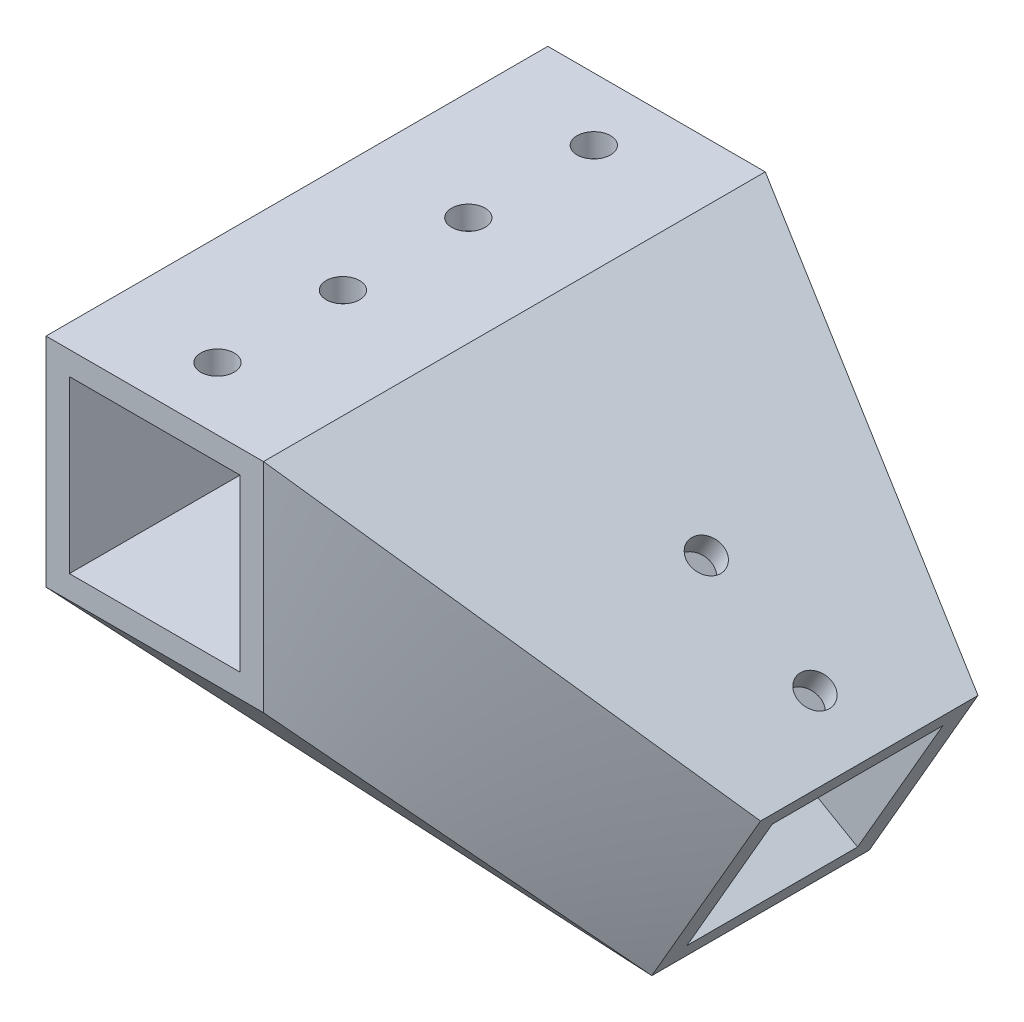
ISO-10303-21;
HEADER;
FILE_DESCRIPTION(('STEP AP214'),'2;1');
FILE_NAME('part.step','',(''),(''),'','','');
FILE_SCHEMA(('AUTOMOTIVE_DESIGN { 1 0 10303 214 1 1 1 1 }'));
ENDSEC;
DATA;
#1=APPLICATION_CONTEXT('core data for automotive mechanical design processes');
#2=APPLICATION_PROTOCOL_DEFINITION('international standard','automotive_design',2000,#1);
#3=PRODUCT_CONTEXT('',#1,'mechanical');
#4=PRODUCT('Part','Part','',(#3));
#5=PRODUCT_RELATED_PRODUCT_CATEGORY('part','',(#4));
#6=PRODUCT_DEFINITION_FORMATION('','',#4);
#7=PRODUCT_DEFINITION_CONTEXT('part definition',#1,'design');
#8=PRODUCT_DEFINITION('design','',#6,#7);
#9=PRODUCT_DEFINITION_SHAPE('','',#8);
#10=(LENGTH_UNIT() NAMED_UNIT(*) SI_UNIT(.MILLI.,.METRE.));
#11=(NAMED_UNIT(*) PLANE_ANGLE_UNIT() SI_UNIT($,.RADIAN.));
#12=(NAMED_UNIT(*) SI_UNIT($,.STERADIAN.) SOLID_ANGLE_UNIT());
#13=UNCERTAINTY_MEASURE_WITH_UNIT(LENGTH_MEASURE(1.E-05),#10,'distance_accuracy_value','');
#14=(GEOMETRIC_REPRESENTATION_CONTEXT(3) GLOBAL_UNCERTAINTY_ASSIGNED_CONTEXT((#13)) GLOBAL_UNIT_ASSIGNED_CONTEXT((#10,
#11,#12)) REPRESENTATION_CONTEXT('',''));
#15=CARTESIAN_POINT('',(0.,0.,0.));
#16=DIRECTION('',(0.,0.,1.));
#17=DIRECTION('',(1.,0.,0.));
#18=AXIS2_PLACEMENT_3D('',#15,#16,#17);
#19=CARTESIAN_POINT('',(26.,0.,0.));
#20=DIRECTION('',(0.,0.,-1.));
#21=DIRECTION('',(-1.,0.,0.));
#22=AXIS2_PLACEMENT_3D('',#19,#20,#21);
#23=PLANE('',#22);
#24=DIRECTION('',(-1.,0.,0.));
#25=VECTOR('',#24,1.);
#26=CARTESIAN_POINT('',(2.80000000000001,23.2,0.));
#27=LINE('',#26,#25);
#28=CARTESIAN_POINT('',(23.2,23.2,0.));
#29=VERTEX_POINT('',#28);
#30=CARTESIAN_POINT('',(2.80000000000001,23.2,0.));
#31=VERTEX_POINT('',#30);
#32=EDGE_CURVE('E199',#29,#31,#27,.T.);
#33=ORIENTED_EDGE('',*,*,#32,.F.);
#34=DIRECTION('',(0.,1.,0.));
#35=VECTOR('',#34,1.);
#36=CARTESIAN_POINT('',(23.2,2.8,0.));
#37=LINE('',#36,#35);
#38=CARTESIAN_POINT('',(23.2,2.8,0.));
#39=VERTEX_POINT('',#38);
#40=EDGE_CURVE('E77',#39,#29,#37,.T.);
#41=ORIENTED_EDGE('',*,*,#40,.F.);
#42=DIRECTION('',(1.,0.,0.));
#43=VECTOR('',#42,1.);
#44=CARTESIAN_POINT('',(2.80000000000001,2.8,0.));
#45=LINE('',#44,#43);
#46=CARTESIAN_POINT('',(2.80000000000001,2.8,0.));
#47=VERTEX_POINT('',#46);
#48=EDGE_CURVE('E205',#47,#39,#45,.T.);
#49=ORIENTED_EDGE('',*,*,#48,.F.);
#50=DIRECTION('',(0.,-1.,0.));
#51=VECTOR('',#50,1.);
#52=CARTESIAN_POINT('',(2.80000000000001,2.8,0.));
#53=LINE('',#52,#51);
#54=EDGE_CURVE('E202',#31,#47,#53,.T.);
#55=ORIENTED_EDGE('',*,*,#54,.F.);
#56=EDGE_LOOP('',(#33,#41,#49,#55));
#57=FACE_BOUND('',#56,.T.);
#58=DIRECTION('',(0.,-1.,0.));
#59=VECTOR('',#58,1.);
#60=CARTESIAN_POINT('',(0.,0.,0.));
#61=LINE('',#60,#59);
#62=CARTESIAN_POINT('',(0.,26.,0.));
#63=VERTEX_POINT('',#62);
#64=CARTESIAN_POINT('',(0.,0.,0.));
#65=VERTEX_POINT('',#64);
#66=EDGE_CURVE('E229',#63,#65,#61,.T.);
#67=ORIENTED_EDGE('',*,*,#66,.T.);
#68=DIRECTION('',(-1.,0.,0.));
#69=VECTOR('',#68,1.);
#70=CARTESIAN_POINT('',(26.,0.,0.));
#71=LINE('',#70,#69);
#72=CARTESIAN_POINT('',(26.,0.,0.));
#73=VERTEX_POINT('',#72);
#74=EDGE_CURVE('E399',#73,#65,#71,.T.);
#75=ORIENTED_EDGE('',*,*,#74,.F.);
#76=DIRECTION('',(0.,1.,0.));
#77=VECTOR('',#76,1.);
#78=CARTESIAN_POINT('',(26.,0.,0.));
#79=LINE('',#78,#77);
#80=CARTESIAN_POINT('',(26.,26.,0.));
#81=VERTEX_POINT('',#80);
#82=EDGE_CURVE('E312',#81,#73,#79,.F.);
#83=ORIENTED_EDGE('',*,*,#82,.F.);
#84=DIRECTION('',(-1.,0.,0.));
#85=VECTOR('',#84,1.);
#86=CARTESIAN_POINT('',(26.,26.,0.));
#87=LINE('',#86,#85);
#88=EDGE_CURVE('E308',#81,#63,#87,.T.);
#89=ORIENTED_EDGE('',*,*,#88,.T.);
#90=EDGE_LOOP('',(#67,#75,#83,#89));
#91=FACE_BOUND('',#90,.T.);
#92=ADVANCED_FACE('F55',(#57,#91),#23,.F.);
#93=CARTESIAN_POINT('',(26.,0.,-60.));
#94=DIRECTION('',(0.,0.,1.));
#95=DIRECTION('',(1.,0.,0.));
#96=AXIS2_PLACEMENT_3D('',#93,#94,#95);
#97=PLANE('',#96);
#98=DIRECTION('',(1.,0.,0.));
#99=VECTOR('',#98,1.);
#100=CARTESIAN_POINT('',(26.,2.8,-60.));
#101=LINE('',#100,#99);
#102=CARTESIAN_POINT('',(2.80000000000001,2.8,-60.));
#103=VERTEX_POINT('',#102);
#104=CARTESIAN_POINT('',(23.2,2.8,-60.));
#105=VERTEX_POINT('',#104);
#106=EDGE_CURVE('E62',#103,#105,#101,.T.);
#107=ORIENTED_EDGE('',*,*,#106,.T.);
#108=DIRECTION('',(0.,1.,0.));
#109=VECTOR('',#108,1.);
#110=CARTESIAN_POINT('',(23.2,0.,-60.));
#111=LINE('',#110,#109);
#112=CARTESIAN_POINT('',(23.2,23.2,-60.));
#113=VERTEX_POINT('',#112);
#114=EDGE_CURVE('E12',#105,#113,#111,.T.);
#115=ORIENTED_EDGE('',*,*,#114,.T.);
#116=DIRECTION('',(-1.,0.,0.));
#117=VECTOR('',#116,1.);
#118=CARTESIAN_POINT('',(26.,23.2,-60.));
#119=LINE('',#118,#117);
#120=CARTESIAN_POINT('',(2.80000000000001,23.2,-60.));
#121=VERTEX_POINT('',#120);
#122=EDGE_CURVE('E395',#113,#121,#119,.T.);
#123=ORIENTED_EDGE('',*,*,#122,.T.);
#124=DIRECTION('',(0.,-1.,0.));
#125=VECTOR('',#124,1.);
#126=CARTESIAN_POINT('',(2.80000000000001,0.,-60.));
#127=LINE('',#126,#125);
#128=EDGE_CURVE('E398',#121,#103,#127,.T.);
#129=ORIENTED_EDGE('',*,*,#128,.T.);
#130=EDGE_LOOP('',(#107,#115,#123,#129));
#131=FACE_BOUND('',#130,.T.);
#132=DIRECTION('',(0.,1.,0.));
#133=VECTOR('',#132,1.);
#134=CARTESIAN_POINT('',(0.,0.,-60.));
#135=LINE('',#134,#133);
#136=CARTESIAN_POINT('',(0.,0.,-60.));
#137=VERTEX_POINT('',#136);
#138=CARTESIAN_POINT('',(0.,26.,-60.));
#139=VERTEX_POINT('',#138);
#140=EDGE_CURVE('E292',#137,#139,#135,.T.);
#141=ORIENTED_EDGE('',*,*,#140,.T.);
#142=DIRECTION('',(-1.,0.,0.));
#143=VECTOR('',#142,1.);
#144=CARTESIAN_POINT('',(26.,26.,-60.));
#145=LINE('',#144,#143);
#146=CARTESIAN_POINT('',(26.,26.,-60.));
#147=VERTEX_POINT('',#146);
#148=EDGE_CURVE('E295',#147,#139,#145,.T.);
#149=ORIENTED_EDGE('',*,*,#148,.F.);
#150=DIRECTION('',(0.,1.,0.));
#151=VECTOR('',#150,1.);
#152=CARTESIAN_POINT('',(26.,0.,-60.));
#153=LINE('',#152,#151);
#154=CARTESIAN_POINT('',(26.,3.47643827251052E-06,-60.));
#155=VERTEX_POINT('',#154);
#156=EDGE_CURVE('E315',#155,#147,#153,.T.);
#157=ORIENTED_EDGE('',*,*,#156,.F.);
#158=DIRECTION('',(1.,0.,0.));
#159=VECTOR('',#158,1.);
#160=CARTESIAN_POINT('',(26.,0.,-60.));
#161=LINE('',#160,#159);
#162=EDGE_CURVE('E297',#155,#137,#161,.F.);
#163=ORIENTED_EDGE('',*,*,#162,.T.);
#164=EDGE_LOOP('',(#141,#149,#157,#163));
#165=FACE_BOUND('',#164,.T.);
#166=ADVANCED_FACE('F278',(#131,#165),#97,.F.);
#167=CARTESIAN_POINT('',(26.,26.,0.));
#168=DIRECTION('',(0.,-1.,0.));
#169=DIRECTION('',(0.,0.,-1.));
#170=AXIS2_PLACEMENT_3D('',#167,#168,#169);
#171=PLANE('',#170);
#172=CARTESIAN_POINT('',(13.,26.,-7.5));
#173=DIRECTION('',(0.,1.,0.));
#174=DIRECTION('',(0.,0.,1.));
#175=AXIS2_PLACEMENT_3D('',#172,#173,#174);
#176=CIRCLE('',#175,2.);
#177=CARTESIAN_POINT('',(13.,26.,-5.5));
#178=VERTEX_POINT('',#177);
#179=EDGE_CURVE('E189',#178,#178,#176,.T.);
#180=ORIENTED_EDGE('',*,*,#179,.F.);
#181=EDGE_LOOP('',(#180));
#182=FACE_BOUND('',#181,.T.);
#183=CARTESIAN_POINT('',(13.,26.,-37.5));
#184=DIRECTION('',(0.,1.,0.));
#185=DIRECTION('',(0.,0.,-1.));
#186=AXIS2_PLACEMENT_3D('',#183,#184,#185);
#187=CIRCLE('',#186,2.);
#188=CARTESIAN_POINT('',(13.,26.,-39.5));
#189=VERTEX_POINT('',#188);
#190=EDGE_CURVE('E484',#189,#189,#187,.T.);
#191=ORIENTED_EDGE('',*,*,#190,.F.);
#192=EDGE_LOOP('',(#191));
#193=FACE_BOUND('',#192,.T.);
#194=CARTESIAN_POINT('',(13.,26.,-52.5));
#195=DIRECTION('',(0.,1.,0.));
#196=DIRECTION('',(0.,0.,-1.));
#197=AXIS2_PLACEMENT_3D('',#194,#195,#196);
#198=CIRCLE('',#197,2.);
#199=CARTESIAN_POINT('',(13.,26.,-54.5));
#200=VERTEX_POINT('',#199);
#201=EDGE_CURVE('E503',#200,#200,#198,.T.);
#202=ORIENTED_EDGE('',*,*,#201,.F.);
#203=EDGE_LOOP('',(#202));
#204=FACE_BOUND('',#203,.T.);
#205=CARTESIAN_POINT('',(13.,26.,-22.5));
#206=DIRECTION('',(0.,1.,0.));
#207=DIRECTION('',(0.,0.,1.));
#208=AXIS2_PLACEMENT_3D('',#205,#206,#207);
#209=CIRCLE('',#208,2.);
#210=CARTESIAN_POINT('',(13.,26.,-20.5));
#211=VERTEX_POINT('',#210);
#212=EDGE_CURVE('E504',#211,#211,#209,.T.);
#213=ORIENTED_EDGE('',*,*,#212,.F.);
#214=EDGE_LOOP('',(#213));
#215=FACE_BOUND('',#214,.T.);
#216=DIRECTION('',(0.,0.,1.));
#217=VECTOR('',#216,1.);
#218=CARTESIAN_POINT('',(0.,26.,0.));
#219=LINE('',#218,#217);
#220=EDGE_CURVE('E300',#139,#63,#219,.T.);
#221=ORIENTED_EDGE('',*,*,#220,.T.);
#222=ORIENTED_EDGE('',*,*,#88,.F.);
#223=DIRECTION('',(0.,0.,1.));
#224=VECTOR('',#223,1.);
#225=CARTESIAN_POINT('',(26.,26.,0.));
#226=LINE('',#225,#224);
#227=EDGE_CURVE('E306',#147,#81,#226,.T.);
#228=ORIENTED_EDGE('',*,*,#227,.F.);
#229=ORIENTED_EDGE('',*,*,#148,.T.);
#230=EDGE_LOOP('',(#221,#222,#228,#229));
#231=FACE_BOUND('',#230,.T.);
#232=ADVANCED_FACE('F275',(#182,#193,#204,#215,#231),#171,.F.);
#233=CARTESIAN_POINT('',(0.,0.,0.));
#234=DIRECTION('',(-1.,0.,0.));
#235=DIRECTION('',(0.,0.,1.));
#236=AXIS2_PLACEMENT_3D('',#233,#234,#235);
#237=PLANE('',#236);
#238=ORIENTED_EDGE('',*,*,#66,.F.);
#239=ORIENTED_EDGE('',*,*,#220,.F.);
#240=ORIENTED_EDGE('',*,*,#140,.F.);
#241=DIRECTION('',(0.,0.,1.));
#242=VECTOR('',#241,1.);
#243=CARTESIAN_POINT('',(0.,0.,0.));
#244=LINE('',#243,#242);
#245=EDGE_CURVE('E301',#65,#137,#244,.F.);
#246=ORIENTED_EDGE('',*,*,#245,.F.);
#247=EDGE_LOOP('',(#238,#239,#240,#246));
#248=FACE_BOUND('',#247,.T.);
#249=ADVANCED_FACE('F266',(#248),#237,.T.);
#250=CARTESIAN_POINT('',(50.6769145362399,-29.2583302491976,0.));
#251=DIRECTION('',(-0.86602540378444,0.499999999999998,0.));
#252=DIRECTION('',(-0.499999999999998,-0.86602540378444,0.));
#253=AXIS2_PLACEMENT_3D('',#250,#251,#252);
#254=PLANE('',#253);
#255=DIRECTION('',(0.,0.,1.));
#256=VECTOR('',#255,1.);
#257=CARTESIAN_POINT('',(67.0352447854375,-0.924871130596316,-19.8));
#258=LINE('',#257,#256);
#259=CARTESIAN_POINT('',(67.0352447854375,-0.924871130596316,-40.2));
#260=VERTEX_POINT('',#259);
#261=CARTESIAN_POINT('',(67.0352447854375,-0.924871130596316,-19.8));
#262=VERTEX_POINT('',#261);
#263=EDGE_CURVE('E188',#260,#262,#258,.T.);
#264=ORIENTED_EDGE('',*,*,#263,.F.);
#265=DIRECTION('',(0.499999999999998,0.86602540378444,0.));
#266=VECTOR('',#265,1.);
#267=CARTESIAN_POINT('',(56.8352447854375,-18.5917893677989,-40.2));
#268=LINE('',#267,#266);
#269=CARTESIAN_POINT('',(56.8352447854375,-18.5917893677989,-40.2));
#270=VERTEX_POINT('',#269);
#271=EDGE_CURVE('E69',#270,#260,#268,.T.);
#272=ORIENTED_EDGE('',*,*,#271,.F.);
#273=DIRECTION('',(0.,0.,-1.));
#274=VECTOR('',#273,1.);
#275=CARTESIAN_POINT('',(56.8352447854375,-18.5917893677989,-19.8));
#276=LINE('',#275,#274);
#277=CARTESIAN_POINT('',(56.8352447854375,-18.5917893677989,-19.8));
#278=VERTEX_POINT('',#277);
#279=EDGE_CURVE('E176',#278,#270,#276,.T.);
#280=ORIENTED_EDGE('',*,*,#279,.F.);
#281=DIRECTION('',(-0.499999999999998,-0.86602540378444,0.));
#282=VECTOR('',#281,1.);
#283=CARTESIAN_POINT('',(56.8352447854375,-18.5917893677989,-19.8));
#284=LINE('',#283,#282);
#285=EDGE_CURVE('E179',#262,#278,#284,.T.);
#286=ORIENTED_EDGE('',*,*,#285,.F.);
#287=EDGE_LOOP('',(#264,#272,#280,#286));
#288=FACE_BOUND('',#287,.T.);
#289=DIRECTION('',(-0.499999999999998,-0.86602540378444,0.));
#290=VECTOR('',#289,1.);
#291=CARTESIAN_POINT('',(55.4352447854375,-21.0166604983953,-43.));
#292=LINE('',#291,#290);
#293=CARTESIAN_POINT('',(68.4352447854375,1.50000000000012,-43.));
#294=VERTEX_POINT('',#293);
#295=CARTESIAN_POINT('',(55.4352447854375,-21.0166604983953,-43.));
#296=VERTEX_POINT('',#295);
#297=EDGE_CURVE('E223',#294,#296,#292,.T.);
#298=ORIENTED_EDGE('',*,*,#297,.F.);
#299=DIRECTION('',(0.,0.,-1.));
#300=VECTOR('',#299,1.);
#301=CARTESIAN_POINT('',(68.4352447854375,1.50000000000012,-17.));
#302=LINE('',#301,#300);
#303=CARTESIAN_POINT('',(68.4352447854375,1.50000000000012,-17.));
#304=VERTEX_POINT('',#303);
#305=EDGE_CURVE('E334',#304,#294,#302,.T.);
#306=ORIENTED_EDGE('',*,*,#305,.F.);
#307=DIRECTION('',(0.499999999999998,0.86602540378444,0.));
#308=VECTOR('',#307,1.);
#309=CARTESIAN_POINT('',(55.4352447854375,-21.0166604983953,-17.));
#310=LINE('',#309,#308);
#311=CARTESIAN_POINT('',(55.4352447854375,-21.0166604983953,-17.));
#312=VERTEX_POINT('',#311);
#313=EDGE_CURVE('E329',#312,#304,#310,.T.);
#314=ORIENTED_EDGE('',*,*,#313,.F.);
#315=DIRECTION('',(0.,0.,1.));
#316=VECTOR('',#315,1.);
#317=CARTESIAN_POINT('',(55.4352447854375,-21.0166604983953,-17.));
#318=LINE('',#317,#316);
#319=EDGE_CURVE('E237',#296,#312,#318,.T.);
#320=ORIENTED_EDGE('',*,*,#319,.F.);
#321=EDGE_LOOP('',(#298,#306,#314,#320));
#322=FACE_BOUND('',#321,.T.);
#323=ADVANCED_FACE('F274',(#288,#322),#254,.F.);
#324=CARTESIAN_POINT('',(26.,26.,0.));
#325=CARTESIAN_POINT('',(68.4352447854375,1.50000000000012,-17.));
#326=CARTESIAN_POINT('',(26.,21.6666666666667,0.));
#327=CARTESIAN_POINT('',(66.2685781187708,-2.25277674973248,-17.));
#328=CARTESIAN_POINT('',(26.,17.3333333333333,0.));
#329=CARTESIAN_POINT('',(64.1019114521042,-6.00555349946506,-17.));
#330=CARTESIAN_POINT('',(26.,8.66666666666666,0.));
#331=CARTESIAN_POINT('',(59.7685781187708,-13.5111069989302,-17.));
#332=CARTESIAN_POINT('',(26.,4.33333333333333,0.));
#333=CARTESIAN_POINT('',(57.6019114521042,-17.2638837486628,-17.));
#334=CARTESIAN_POINT('',(26.,0.,0.));
#335=CARTESIAN_POINT('',(55.4352447854375,-21.0166604983953,-17.));
#336=B_SPLINE_SURFACE_WITH_KNOTS('',3,1,((#324,#325),(#326,#327),(#328,#329),(#330,#331),(#332,
#333),(#334,#335)),.UNSPECIFIED.,.F.,.F.,.F.,(4,2,4),(2,2),(0.,0.5,1.),(0.,1.),.UNSPECIFIED.);
#337=DIRECTION('',(-0.736541159673746,0.525887778708595,0.425381198822178));
#338=VECTOR('',#337,1.);
#339=CARTESIAN_POINT('',(55.4352447854375,-21.0166604983953,-17.));
#340=LINE('',#339,#338);
#341=EDGE_CURVE('E236',#73,#312,#340,.F.);
#342=DIRECTION('',(-0.818183226313986,0.472378305958814,0.327772702093872));
#343=VECTOR('',#342,1.);
#344=CARTESIAN_POINT('',(47.2176223927187,13.7500000000001,-8.5));
#345=LINE('',#344,#343);
#346=EDGE_CURVE('E233',#304,#81,#345,.T.);
#347=ORIENTED_EDGE('',*,*,#82,.T.);
#348=ORIENTED_EDGE('',*,*,#341,.T.);
#349=ORIENTED_EDGE('',*,*,#313,.T.);
#350=ORIENTED_EDGE('',*,*,#346,.T.);
#351=EDGE_LOOP('',(#347,#348,#349,#350));
#352=FACE_BOUND('',#351,.T.);
#353=ADVANCED_FACE('F359',(#352),#336,.T.);
#354=CARTESIAN_POINT('',(17.7583302491976,30.7583302491977,0.));
#355=DIRECTION('',(0.499999999999998,0.86602540378444,0.));
#356=DIRECTION('',(-0.86602540378444,0.499999999999998,0.));
#357=AXIS2_PLACEMENT_3D('',#354,#355,#356);
#358=PLANE('',#357);
#359=CARTESIAN_POINT('',(61.9400542570542,5.25000000000011,-30.));
#360=DIRECTION('',(0.499999999999998,0.86602540378444,0.));
#361=DIRECTION('',(-0.86602540378444,0.499999999999998,0.));
#362=AXIS2_PLACEMENT_3D('',#359,#360,#361);
#363=CIRCLE('',#362,2.);
#364=CARTESIAN_POINT('',(60.2080034494853,6.25000000000012,-30.));
#365=VERTEX_POINT('',#364);
#366=EDGE_CURVE('E478',#365,#365,#363,.T.);
#367=ORIENTED_EDGE('',*,*,#366,.F.);
#368=EDGE_LOOP('',(#367));
#369=FACE_BOUND('',#368,.T.);
#370=CARTESIAN_POINT('',(48.9496732002876,12.7500000000001,-30.));
#371=DIRECTION('',(0.499999999999998,0.86602540378444,0.));
#372=DIRECTION('',(-0.86602540378444,0.499999999999998,0.));
#373=AXIS2_PLACEMENT_3D('',#370,#371,#372);
#374=CIRCLE('',#373,2.);
#375=CARTESIAN_POINT('',(47.2176223927187,13.7500000000001,-30.));
#376=VERTEX_POINT('',#375);
#377=EDGE_CURVE('E487',#376,#376,#374,.T.);
#378=ORIENTED_EDGE('',*,*,#377,.F.);
#379=EDGE_LOOP('',(#378));
#380=FACE_BOUND('',#379,.T.);
#381=ORIENTED_EDGE('',*,*,#346,.F.);
#382=ORIENTED_EDGE('',*,*,#305,.T.);
#383=DIRECTION('',(0.818183226313986,-0.472378305958814,0.327772702093872));
#384=VECTOR('',#383,1.);
#385=CARTESIAN_POINT('',(47.2176223927187,13.7500000000001,-51.5));
#386=LINE('',#385,#384);
#387=EDGE_CURVE('E226',#147,#294,#386,.T.);
#388=ORIENTED_EDGE('',*,*,#387,.F.);
#389=ORIENTED_EDGE('',*,*,#227,.T.);
#390=EDGE_LOOP('',(#381,#382,#388,#389));
#391=FACE_BOUND('',#390,.T.);
#392=ADVANCED_FACE('F263',(#369,#380,#391),#358,.T.);
#393=CARTESIAN_POINT('',(26.,0.,-60.));
#394=CARTESIAN_POINT('',(55.4352447854375,-21.0166604983953,-43.));
#395=CARTESIAN_POINT('',(26.,4.33333333333333,-60.));
#396=CARTESIAN_POINT('',(57.6019114521042,-17.2638837486627,-43.));
#397=CARTESIAN_POINT('',(26.,8.66666666666666,-60.));
#398=CARTESIAN_POINT('',(59.7685781187709,-13.5111069989302,-43.));
#399=CARTESIAN_POINT('',(26.,17.3333333333333,-60.));
#400=CARTESIAN_POINT('',(64.1019114521042,-6.00555349946502,-43.));
#401=CARTESIAN_POINT('',(26.,21.6666666666667,-60.));
#402=CARTESIAN_POINT('',(66.2685781187708,-2.25277674973245,-43.));
#403=CARTESIAN_POINT('',(26.,26.,-60.));
#404=CARTESIAN_POINT('',(68.4352447854375,1.50000000000012,-43.));
#405=B_SPLINE_SURFACE_WITH_KNOTS('',3,1,((#393,#394),(#395,#396),(#397,#398),(#399,#400),(#401,
#402),(#403,#404)),.UNSPECIFIED.,.F.,.F.,.F.,(4,2,4),(2,2),(0.,0.5,1.),(0.,1.),.UNSPECIFIED.);
#406=DIRECTION('',(0.736541159673747,-0.525887778708594,0.425381198822177));
#407=VECTOR('',#406,1.);
#408=CARTESIAN_POINT('',(26.,0.,-60.));
#409=LINE('',#408,#407);
#410=EDGE_CURVE('E230',#155,#296,#409,.T.);
#411=ORIENTED_EDGE('',*,*,#156,.T.);
#412=ORIENTED_EDGE('',*,*,#387,.T.);
#413=ORIENTED_EDGE('',*,*,#297,.T.);
#414=ORIENTED_EDGE('',*,*,#410,.F.);
#415=EDGE_LOOP('',(#411,#412,#413,#414));
#416=FACE_BOUND('',#415,.T.);
#417=ADVANCED_FACE('F250',(#416),#405,.T.);
#418=CARTESIAN_POINT('',(26.,0.,0.));
#419=DIRECTION('',(0.,-0.628896767102531,0.77748881427837));
#420=DIRECTION('',(-1.,0.,0.));
#421=AXIS2_PLACEMENT_3D('',#418,#419,#420);
#422=PLANE('',#421);
#423=ORIENTED_EDGE('',*,*,#74,.T.);
#424=DIRECTION('',(0.898833088566282,-0.340766419274188,-0.275639849066578));
#425=VECTOR('',#424,1.);
#426=CARTESIAN_POINT('',(27.7176223927188,-10.5083302491977,-8.5));
#427=LINE('',#426,#425);
#428=EDGE_CURVE('E211',#65,#312,#427,.T.);
#429=ORIENTED_EDGE('',*,*,#428,.T.);
#430=ORIENTED_EDGE('',*,*,#341,.F.);
#431=EDGE_LOOP('',(#423,#429,#430));
#432=FACE_BOUND('',#431,.T.);
#433=ADVANCED_FACE('F262',(#432),#422,.T.);
#434=CARTESIAN_POINT('',(0.,0.,0.));
#435=DIRECTION('',(-0.354499377387819,-0.935056250410449,0.));
#436=DIRECTION('',(0.935056250410449,-0.354499377387819,0.));
#437=AXIS2_PLACEMENT_3D('',#434,#435,#436);
#438=PLANE('',#437);
#439=DIRECTION('',(0.898833088566282,-0.340766419274188,0.275639849066578));
#440=VECTOR('',#439,1.);
#441=CARTESIAN_POINT('',(0.,0.,-60.));
#442=LINE('',#441,#440);
#443=EDGE_CURVE('E218',#137,#296,#442,.T.);
#444=ORIENTED_EDGE('',*,*,#443,.T.);
#445=ORIENTED_EDGE('',*,*,#319,.T.);
#446=ORIENTED_EDGE('',*,*,#428,.F.);
#447=ORIENTED_EDGE('',*,*,#245,.T.);
#448=EDGE_LOOP('',(#444,#445,#446,#447));
#449=FACE_BOUND('',#448,.T.);
#450=ADVANCED_FACE('F380',(#449),#438,.T.);
#451=CARTESIAN_POINT('',(0.,0.,-60.));
#452=DIRECTION('',(0.,-0.628896767102531,-0.777488814278369));
#453=DIRECTION('',(1.,0.,0.));
#454=AXIS2_PLACEMENT_3D('',#451,#452,#453);
#455=PLANE('',#454);
#456=ORIENTED_EDGE('',*,*,#162,.F.);
#457=ORIENTED_EDGE('',*,*,#410,.T.);
#458=ORIENTED_EDGE('',*,*,#443,.F.);
#459=EDGE_LOOP('',(#456,#457,#458));
#460=FACE_BOUND('',#459,.T.);
#461=ADVANCED_FACE('F361',(#460),#455,.T.);
#462=CARTESIAN_POINT('',(23.2,2.8,-60.000025));
#463=DIRECTION('',(1.,0.,0.));
#464=DIRECTION('',(0.,0.,-1.));
#465=AXIS2_PLACEMENT_3D('',#462,#463,#464);
#466=PLANE('',#465);
#467=DIRECTION('',(0.,0.,1.));
#468=VECTOR('',#467,1.);
#469=CARTESIAN_POINT('',(23.2,2.8,-60.000025));
#470=LINE('',#469,#468);
#471=EDGE_CURVE('E209',#105,#39,#470,.T.);
#472=ORIENTED_EDGE('',*,*,#471,.T.);
#473=ORIENTED_EDGE('',*,*,#40,.T.);
#474=DIRECTION('',(0.,0.,1.));
#475=VECTOR('',#474,1.);
#476=CARTESIAN_POINT('',(23.2,23.2,-60.000025));
#477=LINE('',#476,#475);
#478=EDGE_CURVE('E208',#113,#29,#477,.T.);
#479=ORIENTED_EDGE('',*,*,#478,.F.);
#480=ORIENTED_EDGE('',*,*,#114,.F.);
#481=EDGE_LOOP('',(#472,#473,#479,#480));
#482=FACE_BOUND('',#481,.T.);
#483=ADVANCED_FACE('F409',(#482),#466,.F.);
#484=CARTESIAN_POINT('',(2.80000000000001,2.8,-60.000025));
#485=DIRECTION('',(0.,-1.,0.));
#486=DIRECTION('',(0.,0.,-1.));
#487=AXIS2_PLACEMENT_3D('',#484,#485,#486);
#488=PLANE('',#487);
#489=DIRECTION('',(0.,0.,1.));
#490=VECTOR('',#489,1.);
#491=CARTESIAN_POINT('',(2.80000000000001,2.8,-60.000025));
#492=LINE('',#491,#490);
#493=EDGE_CURVE('E212',#103,#47,#492,.T.);
#494=ORIENTED_EDGE('',*,*,#493,.T.);
#495=ORIENTED_EDGE('',*,*,#48,.T.);
#496=ORIENTED_EDGE('',*,*,#471,.F.);
#497=ORIENTED_EDGE('',*,*,#106,.F.);
#498=EDGE_LOOP('',(#494,#495,#496,#497));
#499=FACE_BOUND('',#498,.T.);
#500=ADVANCED_FACE('F407',(#499),#488,.F.);
#501=CARTESIAN_POINT('',(2.80000000000001,2.8,-60.000025));
#502=DIRECTION('',(-1.,0.,0.));
#503=DIRECTION('',(0.,0.,1.));
#504=AXIS2_PLACEMENT_3D('',#501,#502,#503);
#505=PLANE('',#504);
#506=DIRECTION('',(0.,0.,1.));
#507=VECTOR('',#506,1.);
#508=CARTESIAN_POINT('',(2.80000000000001,23.2,-60.000025));
#509=LINE('',#508,#507);
#510=EDGE_CURVE('E214',#121,#31,#509,.T.);
#511=ORIENTED_EDGE('',*,*,#510,.T.);
#512=ORIENTED_EDGE('',*,*,#54,.T.);
#513=ORIENTED_EDGE('',*,*,#493,.F.);
#514=ORIENTED_EDGE('',*,*,#128,.F.);
#515=EDGE_LOOP('',(#511,#512,#513,#514));
#516=FACE_BOUND('',#515,.T.);
#517=ADVANCED_FACE('F403',(#516),#505,.F.);
#518=CARTESIAN_POINT('',(2.80000000000001,23.2,-60.000025));
#519=DIRECTION('',(0.,1.,0.));
#520=DIRECTION('',(0.,0.,1.));
#521=AXIS2_PLACEMENT_3D('',#518,#519,#520);
#522=PLANE('',#521);
#523=CARTESIAN_POINT('',(13.,23.2,-7.5));
#524=DIRECTION('',(0.,1.,0.));
#525=DIRECTION('',(0.,0.,1.));
#526=AXIS2_PLACEMENT_3D('',#523,#524,#525);
#527=CIRCLE('',#526,2.);
#528=CARTESIAN_POINT('',(13.,23.2,-5.5));
#529=VERTEX_POINT('',#528);
#530=EDGE_CURVE('E492',#529,#529,#527,.F.);
#531=ORIENTED_EDGE('',*,*,#530,.F.);
#532=EDGE_LOOP('',(#531));
#533=FACE_BOUND('',#532,.T.);
#534=CARTESIAN_POINT('',(13.,23.2,-37.5));
#535=DIRECTION('',(0.,1.,0.));
#536=DIRECTION('',(0.,0.,1.));
#537=AXIS2_PLACEMENT_3D('',#534,#535,#536);
#538=CIRCLE('',#537,2.);
#539=CARTESIAN_POINT('',(13.,23.2,-35.5));
#540=VERTEX_POINT('',#539);
#541=EDGE_CURVE('E500',#540,#540,#538,.F.);
#542=ORIENTED_EDGE('',*,*,#541,.F.);
#543=EDGE_LOOP('',(#542));
#544=FACE_BOUND('',#543,.T.);
#545=CARTESIAN_POINT('',(13.,23.2,-52.5));
#546=DIRECTION('',(0.,1.,0.));
#547=DIRECTION('',(0.,0.,1.));
#548=AXIS2_PLACEMENT_3D('',#545,#546,#547);
#549=CIRCLE('',#548,2.);
#550=CARTESIAN_POINT('',(13.,23.2,-50.5));
#551=VERTEX_POINT('',#550);
#552=EDGE_CURVE('E182',#551,#551,#549,.F.);
#553=ORIENTED_EDGE('',*,*,#552,.F.);
#554=EDGE_LOOP('',(#553));
#555=FACE_BOUND('',#554,.T.);
#556=CARTESIAN_POINT('',(13.,23.2,-22.5));
#557=DIRECTION('',(0.,1.,0.));
#558=DIRECTION('',(0.,0.,1.));
#559=AXIS2_PLACEMENT_3D('',#556,#557,#558);
#560=CIRCLE('',#559,2.);
#561=CARTESIAN_POINT('',(13.,23.2,-20.5));
#562=VERTEX_POINT('',#561);
#563=EDGE_CURVE('E495',#562,#562,#560,.F.);
#564=ORIENTED_EDGE('',*,*,#563,.F.);
#565=EDGE_LOOP('',(#564));
#566=FACE_BOUND('',#565,.T.);
#567=ORIENTED_EDGE('',*,*,#478,.T.);
#568=ORIENTED_EDGE('',*,*,#32,.T.);
#569=ORIENTED_EDGE('',*,*,#510,.F.);
#570=ORIENTED_EDGE('',*,*,#122,.F.);
#571=EDGE_LOOP('',(#567,#568,#569,#570));
#572=FACE_BOUND('',#571,.T.);
#573=ADVANCED_FACE('F412',(#533,#544,#555,#566,#572),#522,.F.);
#574=CARTESIAN_POINT('',(30.8544826719043,-3.59178936779895,-40.2));
#575=DIRECTION('',(0.,0.,-1.));
#576=DIRECTION('',(-1.,0.,0.));
#577=AXIS2_PLACEMENT_3D('',#574,#575,#576);
#578=PLANE('',#577);
#579=ORIENTED_EDGE('',*,*,#271,.T.);
#580=DIRECTION('',(0.86602540378444,-0.499999999999998,0.));
#581=VECTOR('',#580,1.);
#582=CARTESIAN_POINT('',(41.0544826719043,14.0751288694036,-40.2));
#583=LINE('',#582,#581);
#584=CARTESIAN_POINT('',(41.0544826719043,14.0751288694036,-40.2));
#585=VERTEX_POINT('',#584);
#586=EDGE_CURVE('E154',#585,#260,#583,.T.);
#587=ORIENTED_EDGE('',*,*,#586,.F.);
#588=DIRECTION('',(0.499999999999998,0.86602540378444,0.));
#589=VECTOR('',#588,1.);
#590=CARTESIAN_POINT('',(30.8544826719043,-3.59178936779895,-40.2));
#591=LINE('',#590,#589);
#592=CARTESIAN_POINT('',(30.8544826719043,-3.59178936779895,-40.2));
#593=VERTEX_POINT('',#592);
#594=EDGE_CURVE('E158',#593,#585,#591,.T.);
#595=ORIENTED_EDGE('',*,*,#594,.F.);
#596=DIRECTION('',(0.86602540378444,-0.499999999999998,0.));
#597=VECTOR('',#596,1.);
#598=CARTESIAN_POINT('',(30.8544826719043,-3.59178936779895,-40.2));
#599=LINE('',#598,#597);
#600=EDGE_CURVE('E193',#593,#270,#599,.T.);
#601=ORIENTED_EDGE('',*,*,#600,.T.);
#602=EDGE_LOOP('',(#579,#587,#595,#601));
#603=FACE_BOUND('',#602,.T.);
#604=ADVANCED_FACE('F156',(#603),#578,.F.);
#605=CARTESIAN_POINT('',(30.8544826719043,-3.59178936779895,-19.8));
#606=DIRECTION('',(-0.499999999999998,-0.86602540378444,0.));
#607=DIRECTION('',(0.86602540378444,-0.499999999999998,0.));
#608=AXIS2_PLACEMENT_3D('',#605,#606,#607);
#609=PLANE('',#608);
#610=ORIENTED_EDGE('',*,*,#279,.T.);
#611=ORIENTED_EDGE('',*,*,#600,.F.);
#612=DIRECTION('',(0.,0.,-1.));
#613=VECTOR('',#612,1.);
#614=CARTESIAN_POINT('',(30.8544826719043,-3.59178936779895,-19.8));
#615=LINE('',#614,#613);
#616=CARTESIAN_POINT('',(30.8544826719043,-3.59178936779895,-19.8));
#617=VERTEX_POINT('',#616);
#618=EDGE_CURVE('E164',#617,#593,#615,.T.);
#619=ORIENTED_EDGE('',*,*,#618,.F.);
#620=DIRECTION('',(0.86602540378444,-0.499999999999998,0.));
#621=VECTOR('',#620,1.);
#622=CARTESIAN_POINT('',(30.8544826719043,-3.59178936779895,-19.8));
#623=LINE('',#622,#621);
#624=EDGE_CURVE('E195',#617,#278,#623,.T.);
#625=ORIENTED_EDGE('',*,*,#624,.T.);
#626=EDGE_LOOP('',(#610,#611,#619,#625));
#627=FACE_BOUND('',#626,.T.);
#628=ADVANCED_FACE('F437',(#627),#609,.F.);
#629=CARTESIAN_POINT('',(30.8544826719043,-3.59178936779895,-19.8));
#630=DIRECTION('',(0.,0.,1.));
#631=DIRECTION('',(1.,0.,0.));
#632=AXIS2_PLACEMENT_3D('',#629,#630,#631);
#633=PLANE('',#632);
#634=ORIENTED_EDGE('',*,*,#285,.T.);
#635=ORIENTED_EDGE('',*,*,#624,.F.);
#636=DIRECTION('',(-0.499999999999998,-0.86602540378444,0.));
#637=VECTOR('',#636,1.);
#638=CARTESIAN_POINT('',(30.8544826719043,-3.59178936779895,-19.8));
#639=LINE('',#638,#637);
#640=CARTESIAN_POINT('',(41.0544826719043,14.0751288694036,-19.8));
#641=VERTEX_POINT('',#640);
#642=EDGE_CURVE('E172',#641,#617,#639,.T.);
#643=ORIENTED_EDGE('',*,*,#642,.F.);
#644=DIRECTION('',(0.86602540378444,-0.499999999999998,0.));
#645=VECTOR('',#644,1.);
#646=CARTESIAN_POINT('',(41.0544826719043,14.0751288694036,-19.8));
#647=LINE('',#646,#645);
#648=EDGE_CURVE('E163',#641,#262,#647,.T.);
#649=ORIENTED_EDGE('',*,*,#648,.T.);
#650=EDGE_LOOP('',(#634,#635,#643,#649));
#651=FACE_BOUND('',#650,.T.);
#652=ADVANCED_FACE('F440',(#651),#633,.F.);
#653=CARTESIAN_POINT('',(41.0544826719043,14.0751288694036,-19.8));
#654=DIRECTION('',(0.499999999999998,0.86602540378444,0.));
#655=DIRECTION('',(-0.86602540378444,0.499999999999998,0.));
#656=AXIS2_PLACEMENT_3D('',#653,#654,#655);
#657=PLANE('',#656);
#658=CARTESIAN_POINT('',(60.5400542570542,2.82512886940367,-30.));
#659=DIRECTION('',(0.499999999999998,0.86602540378444,0.));
#660=DIRECTION('',(-0.86602540378444,0.499999999999998,0.));
#661=AXIS2_PLACEMENT_3D('',#658,#659,#660);
#662=CIRCLE('',#661,2.);
#663=CARTESIAN_POINT('',(58.8080034494853,3.82512886940366,-30.));
#664=VERTEX_POINT('',#663);
#665=EDGE_CURVE('E481',#664,#664,#662,.F.);
#666=ORIENTED_EDGE('',*,*,#665,.F.);
#667=EDGE_LOOP('',(#666));
#668=FACE_BOUND('',#667,.T.);
#669=CARTESIAN_POINT('',(47.5496732002876,10.3251288694036,-30.));
#670=DIRECTION('',(0.499999999999998,0.86602540378444,0.));
#671=DIRECTION('',(-0.86602540378444,0.499999999999998,0.));
#672=AXIS2_PLACEMENT_3D('',#669,#670,#671);
#673=CIRCLE('',#672,2.);
#674=CARTESIAN_POINT('',(45.8176223927187,11.3251288694036,-30.));
#675=VERTEX_POINT('',#674);
#676=EDGE_CURVE('E482',#675,#675,#673,.F.);
#677=ORIENTED_EDGE('',*,*,#676,.F.);
#678=EDGE_LOOP('',(#677));
#679=FACE_BOUND('',#678,.T.);
#680=ORIENTED_EDGE('',*,*,#263,.T.);
#681=ORIENTED_EDGE('',*,*,#648,.F.);
#682=DIRECTION('',(0.,0.,1.));
#683=VECTOR('',#682,1.);
#684=CARTESIAN_POINT('',(41.0544826719043,14.0751288694036,-19.8));
#685=LINE('',#684,#683);
#686=EDGE_CURVE('E167',#585,#641,#685,.T.);
#687=ORIENTED_EDGE('',*,*,#686,.F.);
#688=ORIENTED_EDGE('',*,*,#586,.T.);
#689=EDGE_LOOP('',(#680,#681,#687,#688));
#690=FACE_BOUND('',#689,.T.);
#691=ADVANCED_FACE('F168',(#668,#679,#690),#657,.F.);
#692=CARTESIAN_POINT('',(24.6961524227067,-14.2583302491977,0.));
#693=DIRECTION('',(-0.86602540378444,0.499999999999998,0.));
#694=DIRECTION('',(-0.499999999999998,-0.86602540378444,0.));
#695=AXIS2_PLACEMENT_3D('',#692,#693,#694);
#696=PLANE('',#695);
#697=ORIENTED_EDGE('',*,*,#594,.T.);
#698=ORIENTED_EDGE('',*,*,#686,.T.);
#699=ORIENTED_EDGE('',*,*,#642,.T.);
#700=ORIENTED_EDGE('',*,*,#618,.T.);
#701=EDGE_LOOP('',(#697,#698,#699,#700));
#702=FACE_BOUND('',#701,.T.);
#703=ADVANCED_FACE('F174',(#702),#696,.F.);
#704=CARTESIAN_POINT('',(13.,-21.0177604983953,-22.5));
#705=DIRECTION('',(0.,1.,0.));
#706=DIRECTION('',(0.,0.,1.));
#707=AXIS2_PLACEMENT_3D('',#704,#705,#706);
#708=CYLINDRICAL_SURFACE('',#707,2.);
#709=ORIENTED_EDGE('',*,*,#212,.T.);
#710=EDGE_LOOP('',(#709));
#711=FACE_BOUND('',#710,.T.);
#712=ORIENTED_EDGE('',*,*,#563,.T.);
#713=EDGE_LOOP('',(#712));
#714=FACE_BOUND('',#713,.T.);
#715=ADVANCED_FACE('F450',(#711,#714),#708,.F.);
#716=CARTESIAN_POINT('',(13.,-21.0177604983953,-52.5));
#717=DIRECTION('',(0.,1.,0.));
#718=DIRECTION('',(0.,0.,1.));
#719=AXIS2_PLACEMENT_3D('',#716,#717,#718);
#720=CYLINDRICAL_SURFACE('',#719,2.);
#721=ORIENTED_EDGE('',*,*,#201,.T.);
#722=EDGE_LOOP('',(#721));
#723=FACE_BOUND('',#722,.T.);
#724=ORIENTED_EDGE('',*,*,#552,.T.);
#725=EDGE_LOOP('',(#724));
#726=FACE_BOUND('',#725,.T.);
#727=ADVANCED_FACE('F451',(#723,#726),#720,.F.);
#728=CARTESIAN_POINT('',(13.,-21.0177604983953,-37.5));
#729=DIRECTION('',(0.,1.,0.));
#730=DIRECTION('',(0.,0.,1.));
#731=AXIS2_PLACEMENT_3D('',#728,#729,#730);
#732=CYLINDRICAL_SURFACE('',#731,2.);
#733=ORIENTED_EDGE('',*,*,#190,.T.);
#734=EDGE_LOOP('',(#733));
#735=FACE_BOUND('',#734,.T.);
#736=ORIENTED_EDGE('',*,*,#541,.T.);
#737=EDGE_LOOP('',(#736));
#738=FACE_BOUND('',#737,.T.);
#739=ADVANCED_FACE('F454',(#735,#738),#732,.F.);
#740=CARTESIAN_POINT('',(13.,-21.0177604983953,-7.5));
#741=DIRECTION('',(0.,1.,0.));
#742=DIRECTION('',(0.,0.,1.));
#743=AXIS2_PLACEMENT_3D('',#740,#741,#742);
#744=CYLINDRICAL_SURFACE('',#743,2.);
#745=ORIENTED_EDGE('',*,*,#179,.T.);
#746=EDGE_LOOP('',(#745));
#747=FACE_BOUND('',#746,.T.);
#748=ORIENTED_EDGE('',*,*,#530,.T.);
#749=EDGE_LOOP('',(#748));
#750=FACE_BOUND('',#749,.T.);
#751=ADVANCED_FACE('F461',(#747,#750),#744,.F.);
#752=CARTESIAN_POINT('',(22.0901294399563,-33.7720944610136,-30.));
#753=DIRECTION('',(0.499999999999998,0.86602540378444,0.));
#754=DIRECTION('',(-0.86602540378444,0.499999999999998,0.));
#755=AXIS2_PLACEMENT_3D('',#752,#753,#754);
#756=CYLINDRICAL_SURFACE('',#755,2.);
#757=CARTESIAN_POINT('',(47.2176223927187,13.7500000000001,-30.));
#758=CARTESIAN_POINT('',(47.2030390593854,13.724740925723,-30.));
#759=CARTESIAN_POINT('',(47.1884557260521,13.699481851446,-30.));
#760=CARTESIAN_POINT('',(47.1592890593854,13.6489637028919,-30.));
#761=CARTESIAN_POINT('',(47.1447057260521,13.6237046286149,-30.));
#762=CARTESIAN_POINT('',(47.1155390593854,13.5731864800608,-30.));
#763=CARTESIAN_POINT('',(47.100955726052,13.5479274057837,-30.));
#764=CARTESIAN_POINT('',(47.0717890593854,13.4974092572296,-30.));
#765=CARTESIAN_POINT('',(47.0572057260521,13.4721501829526,-30.));
#766=CARTESIAN_POINT('',(47.0280390593854,13.4216320343985,-30.));
#767=CARTESIAN_POINT('',(47.0134557260521,13.3963729601214,-30.));
#768=CARTESIAN_POINT('',(46.9842890593854,13.3458548115673,-30.));
#769=CARTESIAN_POINT('',(46.9697057260521,13.3205957372903,-30.));
#770=CARTESIAN_POINT('',(46.9405390593854,13.2700775887362,-30.));
#771=CARTESIAN_POINT('',(46.9259557260521,13.2448185144592,-30.));
#772=CARTESIAN_POINT('',(46.8967890593854,13.1943003659051,-30.));
#773=CARTESIAN_POINT('',(46.882205726052,13.169041291628,-30.));
#774=CARTESIAN_POINT('',(46.8530390593854,13.1185231430739,-30.));
#775=CARTESIAN_POINT('',(46.8384557260521,13.0932640687969,-30.));
#776=CARTESIAN_POINT('',(46.8092890593854,13.0427459202428,-30.));
#777=CARTESIAN_POINT('',(46.7947057260521,13.0174868459657,-30.));
#778=CARTESIAN_POINT('',(46.7655390593854,12.9669686974116,-30.));
#779=CARTESIAN_POINT('',(46.7509557260521,12.9417096231346,-30.));
#780=CARTESIAN_POINT('',(46.7217890593854,12.8911914745805,-30.));
#781=CARTESIAN_POINT('',(46.7072057260521,12.8659324003035,-30.));
#782=CARTESIAN_POINT('',(46.6780390593854,12.8154142517494,-30.));
#783=CARTESIAN_POINT('',(46.6634557260521,12.7901551774723,-30.));
#784=CARTESIAN_POINT('',(46.6342890593854,12.7396370289182,-30.));
#785=CARTESIAN_POINT('',(46.6197057260521,12.7143779546412,-30.));
#786=CARTESIAN_POINT('',(46.5905390593854,12.6638598060871,-30.));
#787=CARTESIAN_POINT('',(46.5759557260521,12.63860073181,-30.));
#788=CARTESIAN_POINT('',(46.5467890593854,12.5880825832559,-30.));
#789=CARTESIAN_POINT('',(46.5322057260521,12.5628235089789,-30.));
#790=CARTESIAN_POINT('',(46.5030390593854,12.5123053604248,-30.));
#791=CARTESIAN_POINT('',(46.4884557260521,12.4870462861478,-30.));
#792=CARTESIAN_POINT('',(46.4592890593854,12.4365281375937,-30.));
#793=CARTESIAN_POINT('',(46.4447057260521,12.4112690633166,-30.));
#794=CARTESIAN_POINT('',(46.4155390593854,12.3607509147625,-30.));
#795=CARTESIAN_POINT('',(46.4009557260521,12.3354918404855,-30.));
#796=CARTESIAN_POINT('',(46.3717890593854,12.2849736919314,-30.));
#797=CARTESIAN_POINT('',(46.3572057260521,12.2597146176544,-30.));
#798=CARTESIAN_POINT('',(46.3280390593854,12.2091964691003,-30.));
#799=CARTESIAN_POINT('',(46.3134557260521,12.1839373948232,-30.));
#800=CARTESIAN_POINT('',(46.2842890593854,12.1334192462691,-30.));
#801=CARTESIAN_POINT('',(46.2697057260521,12.1081601719921,-30.));
#802=CARTESIAN_POINT('',(46.2405390593854,12.057642023438,-30.));
#803=CARTESIAN_POINT('',(46.225955726052,12.0323829491609,-30.));
#804=CARTESIAN_POINT('',(46.1967890593854,11.9818648006068,-30.));
#805=CARTESIAN_POINT('',(46.1822057260521,11.9566057263298,-30.));
#806=CARTESIAN_POINT('',(46.1530390593854,11.9060875777757,-30.));
#807=CARTESIAN_POINT('',(46.1384557260521,11.8808285034987,-30.));
#808=CARTESIAN_POINT('',(46.1092890593854,11.8303103549446,-30.));
#809=CARTESIAN_POINT('',(46.094705726052,11.8050512806675,-30.));
#810=CARTESIAN_POINT('',(46.0655390593854,11.7545331321134,-30.));
#811=CARTESIAN_POINT('',(46.0509557260521,11.7292740578364,-30.));
#812=CARTESIAN_POINT('',(46.0217890593854,11.6787559092823,-30.));
#813=CARTESIAN_POINT('',(46.0072057260521,11.6534968350052,-30.));
#814=CARTESIAN_POINT('',(45.9780390593854,11.6029786864511,-30.));
#815=CARTESIAN_POINT('',(45.9634557260521,11.5777196121741,-30.));
#816=CARTESIAN_POINT('',(45.9342890593854,11.52720146362,-30.));
#817=CARTESIAN_POINT('',(45.9197057260521,11.501942389343,-30.));
#818=CARTESIAN_POINT('',(45.8905390593854,11.4514242407889,-30.));
#819=CARTESIAN_POINT('',(45.8759557260521,11.4261651665118,-30.));
#820=CARTESIAN_POINT('',(45.8467890593854,11.3756470179577,-30.));
#821=CARTESIAN_POINT('',(45.8322057260521,11.3503879436807,-30.));
#822=CARTESIAN_POINT('',(45.8176223927187,11.3251288694036,-30.));
#823=B_SPLINE_CURVE_WITH_KNOTS('',3,(#757,#758,#759,#760,#761,#762,#763,#764,#765,#766,#767,
#768,#769,#770,#771,#772,#773,#774,#775,#776,#777,#778,#779,#780,#781,#782,#783,#784,#785,#786,
#787,#788,#789,#790,#791,#792,#793,#794,#795,#796,#797,#798,#799,#800,#801,#802,#803,#804,#805,
#806,#807,#808,#809,#810,#811,#812,#813,#814,#815,#816,#817,#818,#819,#820,#821,#822),
.UNSPECIFIED.,.F.,.F.,(4,2,2,2,2,2,2,2,2,2,2,2,2,2,2,2,2,2,2,2,2,2,2,2,2,2,2,2,2,2,2,2,4),(0.,
0.0874999999999943,0.174999999999998,0.262500000000002,0.350000000000002,0.4375,
0.525000000000004,0.612499999999998,0.700000000000005,0.787500000000006,0.875,0.962500000000004,
1.05,1.1375,1.22500000000001,1.31250000000001,1.4,1.4875,1.57500000000001,1.6625,
1.75000000000001,1.83750000000001,1.92500000000001,2.01250000000001,2.1,2.18750000000001,
2.27500000000001,2.36250000000001,2.45000000000001,2.53750000000001,2.62500000000001,
2.71250000000001,2.80000000000001),.UNSPECIFIED.);
#824=EDGE_CURVE('BSEAM465',#376,#675,#823,.T.);
#825=ORIENTED_EDGE('',*,*,#377,.T.);
#826=ORIENTED_EDGE('',*,*,#676,.T.);
#827=ORIENTED_EDGE('',*,*,#824,.T.);
#828=ORIENTED_EDGE('',*,*,#824,.F.);
#829=EDGE_LOOP('',(#825,#827,#826,#828));
#830=FACE_BOUND('',#829,.T.);
#831=ADVANCED_FACE('F465',(#830),#756,.F.);
#832=CARTESIAN_POINT('',(35.0805104967229,-41.2720944610136,-30.));
#833=DIRECTION('',(0.499999999999998,0.86602540378444,0.));
#834=DIRECTION('',(-0.86602540378444,0.499999999999998,0.));
#835=AXIS2_PLACEMENT_3D('',#832,#833,#834);
#836=CYLINDRICAL_SURFACE('',#835,2.);
#837=CARTESIAN_POINT('',(60.2080034494853,6.25000000000012,-30.));
#838=CARTESIAN_POINT('',(60.193420116152,6.22474092572307,-30.));
#839=CARTESIAN_POINT('',(60.1788367828186,6.19948185144602,-30.));
#840=CARTESIAN_POINT('',(60.149670116152,6.14896370289193,-30.));
#841=CARTESIAN_POINT('',(60.1350867828186,6.12370462861489,-30.));
#842=CARTESIAN_POINT('',(60.105920116152,6.07318648006079,-30.));
#843=CARTESIAN_POINT('',(60.0913367828187,6.04792740578374,-30.));
#844=CARTESIAN_POINT('',(60.062170116152,5.99740925722965,-30.));
#845=CARTESIAN_POINT('',(60.0475867828186,5.97215018295261,-30.));
#846=CARTESIAN_POINT('',(60.018420116152,5.92163203439851,-30.));
#847=CARTESIAN_POINT('',(60.0038367828186,5.89637296012146,-30.));
#848=CARTESIAN_POINT('',(59.974670116152,5.84585481156737,-30.));
#849=CARTESIAN_POINT('',(59.9600867828186,5.82059573729033,-30.));
#850=CARTESIAN_POINT('',(59.930920116152,5.77007758873624,-30.));
#851=CARTESIAN_POINT('',(59.9163367828186,5.74481851445919,-30.));
#852=CARTESIAN_POINT('',(59.887170116152,5.6943003659051,-30.));
#853=CARTESIAN_POINT('',(59.8725867828187,5.66904129162805,-30.));
#854=CARTESIAN_POINT('',(59.843420116152,5.61852314307396,-30.));
#855=CARTESIAN_POINT('',(59.8288367828187,5.59326406879691,-30.));
#856=CARTESIAN_POINT('',(59.799670116152,5.54274592024281,-30.));
#857=CARTESIAN_POINT('',(59.7850867828186,5.51748684596577,-30.));
#858=CARTESIAN_POINT('',(59.755920116152,5.46696869741168,-30.));
#859=CARTESIAN_POINT('',(59.7413367828186,5.44170962313463,-30.));
#860=CARTESIAN_POINT('',(59.712170116152,5.39119147458054,-30.));
#861=CARTESIAN_POINT('',(59.6975867828186,5.36593240030349,-30.));
#862=CARTESIAN_POINT('',(59.668420116152,5.3154142517494,-30.));
#863=CARTESIAN_POINT('',(59.6538367828186,5.29015517747235,-30.));
#864=CARTESIAN_POINT('',(59.624670116152,5.23963702891826,-30.));
#865=CARTESIAN_POINT('',(59.6100867828186,5.21437795464121,-30.));
#866=CARTESIAN_POINT('',(59.580920116152,5.16385980608712,-30.));
#867=CARTESIAN_POINT('',(59.5663367828186,5.13860073181008,-30.));
#868=CARTESIAN_POINT('',(59.537170116152,5.08808258325598,-30.));
#869=CARTESIAN_POINT('',(59.5225867828186,5.06282350897893,-30.));
#870=CARTESIAN_POINT('',(59.493420116152,5.01230536042484,-30.));
#871=CARTESIAN_POINT('',(59.4788367828186,4.98704628614779,-30.));
#872=CARTESIAN_POINT('',(59.449670116152,4.9365281375937,-30.));
#873=CARTESIAN_POINT('',(59.4350867828186,4.91126906331666,-30.));
#874=CARTESIAN_POINT('',(59.405920116152,4.86075091476257,-30.));
#875=CARTESIAN_POINT('',(59.3913367828186,4.83549184048552,-30.));
#876=CARTESIAN_POINT('',(59.362170116152,4.78497369193143,-30.));
#877=CARTESIAN_POINT('',(59.3475867828186,4.75971461765438,-30.));
#878=CARTESIAN_POINT('',(59.318420116152,4.70919646910029,-30.));
#879=CARTESIAN_POINT('',(59.3038367828186,4.68393739482324,-30.));
#880=CARTESIAN_POINT('',(59.274670116152,4.63341924626915,-30.));
#881=CARTESIAN_POINT('',(59.2600867828186,4.6081601719921,-30.));
#882=CARTESIAN_POINT('',(59.230920116152,4.55764202343801,-30.));
#883=CARTESIAN_POINT('',(59.2163367828186,4.53238294916096,-30.));
#884=CARTESIAN_POINT('',(59.187170116152,4.48186480060687,-30.));
#885=CARTESIAN_POINT('',(59.1725867828186,4.45660572632982,-30.));
#886=CARTESIAN_POINT('',(59.143420116152,4.40608757777573,-30.));
#887=CARTESIAN_POINT('',(59.1288367828186,4.38082850349868,-30.));
#888=CARTESIAN_POINT('',(59.099670116152,4.33031035494459,-30.));
#889=CARTESIAN_POINT('',(59.0850867828186,4.30505128066754,-30.));
#890=CARTESIAN_POINT('',(59.055920116152,4.25453313211345,-30.));
#891=CARTESIAN_POINT('',(59.0413367828186,4.22927405783641,-30.));
#892=CARTESIAN_POINT('',(59.012170116152,4.17875590928231,-30.));
#893=CARTESIAN_POINT('',(58.9975867828186,4.15349683500527,-30.));
#894=CARTESIAN_POINT('',(58.968420116152,4.10297868645117,-30.));
#895=CARTESIAN_POINT('',(58.9538367828186,4.07771961217412,-30.));
#896=CARTESIAN_POINT('',(58.924670116152,4.02720146362003,-30.));
#897=CARTESIAN_POINT('',(58.9100867828186,4.00194238934299,-30.));
#898=CARTESIAN_POINT('',(58.880920116152,3.9514242407889,-30.));
#899=CARTESIAN_POINT('',(58.8663367828186,3.92616516651185,-30.));
#900=CARTESIAN_POINT('',(58.837170116152,3.87564701795776,-30.));
#901=CARTESIAN_POINT('',(58.8225867828186,3.85038794368071,-30.));
#902=CARTESIAN_POINT('',(58.8080034494853,3.82512886940366,-30.));
#903=B_SPLINE_CURVE_WITH_KNOTS('',3,(#837,#838,#839,#840,#841,#842,#843,#844,#845,#846,#847,
#848,#849,#850,#851,#852,#853,#854,#855,#856,#857,#858,#859,#860,#861,#862,#863,#864,#865,#866,
#867,#868,#869,#870,#871,#872,#873,#874,#875,#876,#877,#878,#879,#880,#881,#882,#883,#884,#885,
#886,#887,#888,#889,#890,#891,#892,#893,#894,#895,#896,#897,#898,#899,#900,#901,#902),
.UNSPECIFIED.,.F.,.F.,(4,2,2,2,2,2,2,2,2,2,2,2,2,2,2,2,2,2,2,2,2,2,2,2,2,2,2,2,2,2,2,2,4),(0.,
0.0875000000000073,0.175000000000002,0.262500000000002,0.350000000000009,0.437500000000009,
0.525000000000007,0.612500000000005,0.700000000000005,0.787500000000015,0.875000000000013,
0.962500000000007,1.05000000000001,1.13750000000001,1.22500000000001,1.31250000000001,
1.40000000000002,1.48750000000002,1.57500000000002,1.66250000000001,1.75000000000002,
1.83750000000002,1.92500000000002,2.01250000000002,2.10000000000002,2.18750000000003,
2.27500000000002,2.36250000000002,2.45000000000003,2.53750000000003,2.62500000000003,
2.71250000000002,2.80000000000003),.UNSPECIFIED.);
#904=EDGE_CURVE('BSEAM469',#365,#664,#903,.T.);
#905=ORIENTED_EDGE('',*,*,#366,.T.);
#906=ORIENTED_EDGE('',*,*,#665,.T.);
#907=ORIENTED_EDGE('',*,*,#904,.T.);
#908=ORIENTED_EDGE('',*,*,#904,.F.);
#909=EDGE_LOOP('',(#905,#907,#906,#908));
#910=FACE_BOUND('',#909,.T.);
#911=ADVANCED_FACE('F469',(#910),#836,.F.);
#912=CLOSED_SHELL('',(#92,#166,#232,#249,#323,#353,#392,#417,#433,#450,#461,#483,#500,#517,#573,
#604,#628,#652,#691,#703,#715,#727,#739,#751,#831,#911));
#913=MANIFOLD_SOLID_BREP('B2',#912);
#914=ADVANCED_BREP_SHAPE_REPRESENTATION('',(#18,#913),#14);
#915=SHAPE_DEFINITION_REPRESENTATION(#9,#914);
ENDSEC;
END-ISO-10303-21;
